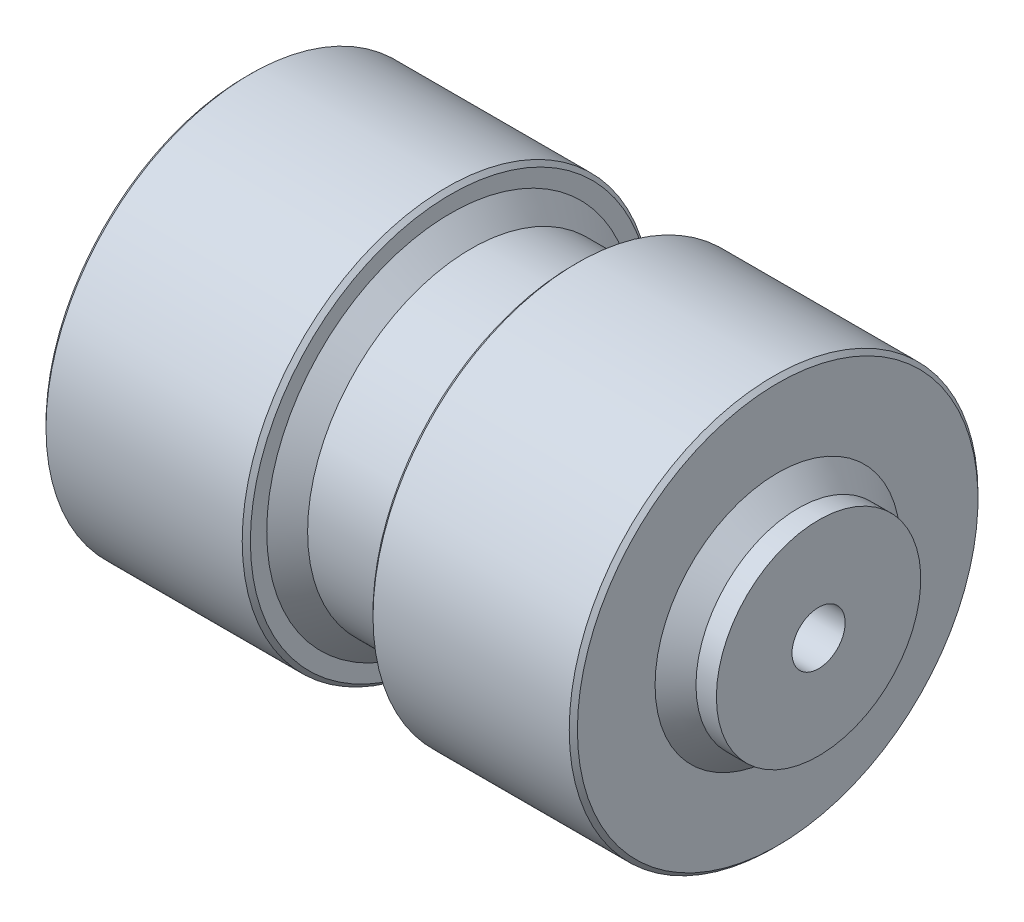
ISO-10303-21;
HEADER;
FILE_DESCRIPTION(('STEP AP214'),'2;1');
FILE_NAME('part.step','',(''),(''),'','','');
FILE_SCHEMA(('AUTOMOTIVE_DESIGN { 1 0 10303 214 1 1 1 1 }'));
ENDSEC;
DATA;
#1=APPLICATION_CONTEXT('core data for automotive mechanical design processes');
#2=APPLICATION_PROTOCOL_DEFINITION('international standard','automotive_design',2000,#1);
#3=PRODUCT_CONTEXT('',#1,'mechanical');
#4=PRODUCT('Part','Part','',(#3));
#5=PRODUCT_RELATED_PRODUCT_CATEGORY('part','',(#4));
#6=PRODUCT_DEFINITION_FORMATION('','',#4);
#7=PRODUCT_DEFINITION_CONTEXT('part definition',#1,'design');
#8=PRODUCT_DEFINITION('design','',#6,#7);
#9=PRODUCT_DEFINITION_SHAPE('','',#8);
#10=(LENGTH_UNIT() NAMED_UNIT(*) SI_UNIT(.MILLI.,.METRE.));
#11=(NAMED_UNIT(*) PLANE_ANGLE_UNIT() SI_UNIT($,.RADIAN.));
#12=(NAMED_UNIT(*) SI_UNIT($,.STERADIAN.) SOLID_ANGLE_UNIT());
#13=UNCERTAINTY_MEASURE_WITH_UNIT(LENGTH_MEASURE(1.E-05),#10,'distance_accuracy_value','');
#14=(GEOMETRIC_REPRESENTATION_CONTEXT(3) GLOBAL_UNCERTAINTY_ASSIGNED_CONTEXT((#13)) GLOBAL_UNIT_ASSIGNED_CONTEXT((#10,
#11,#12)) REPRESENTATION_CONTEXT('',''));
#15=CARTESIAN_POINT('',(0.,0.,0.));
#16=DIRECTION('',(0.,0.,1.));
#17=DIRECTION('',(1.,0.,0.));
#18=AXIS2_PLACEMENT_3D('',#15,#16,#17);
#19=CARTESIAN_POINT('',(-7.5,0.,0.));
#20=DIRECTION('',(-1.,0.,0.));
#21=DIRECTION('',(0.,0.,1.));
#22=AXIS2_PLACEMENT_3D('',#19,#20,#21);
#23=CYLINDRICAL_SURFACE('',#22,5.);
#24=CARTESIAN_POINT('',(-1.6,0.,0.));
#25=DIRECTION('',(-1.,0.,0.));
#26=DIRECTION('',(0.,0.,1.));
#27=AXIS2_PLACEMENT_3D('',#24,#25,#26);
#28=CIRCLE('',#27,5.);
#29=CARTESIAN_POINT('',(-1.6,0.,5.));
#30=VERTEX_POINT('',#29);
#31=EDGE_CURVE('E42',#30,#30,#28,.T.);
#32=ORIENTED_EDGE('',*,*,#31,.T.);
#33=EDGE_LOOP('',(#32));
#34=FACE_BOUND('',#33,.T.);
#35=CARTESIAN_POINT('',(-6.4,0.,0.));
#36=DIRECTION('',(1.,0.,0.));
#37=DIRECTION('',(0.,0.,-1.));
#38=AXIS2_PLACEMENT_3D('',#35,#36,#37);
#39=CIRCLE('',#38,5.);
#40=CARTESIAN_POINT('',(-6.4,0.,-5.));
#41=VERTEX_POINT('',#40);
#42=EDGE_CURVE('E46',#41,#41,#39,.T.);
#43=ORIENTED_EDGE('',*,*,#42,.T.);
#44=EDGE_LOOP('',(#43));
#45=FACE_BOUND('',#44,.T.);
#46=ADVANCED_FACE('F31',(#34,#45),#23,.T.);
#47=CARTESIAN_POINT('',(-1.5,5.,0.));
#48=DIRECTION('',(-1.,0.,0.));
#49=DIRECTION('',(0.,0.,1.));
#50=AXIS2_PLACEMENT_3D('',#47,#48,#49);
#51=PLANE('',#50);
#52=CARTESIAN_POINT('',(-1.5,0.,0.));
#53=DIRECTION('',(-1.,0.,0.));
#54=DIRECTION('',(0.,0.,1.));
#55=AXIS2_PLACEMENT_3D('',#52,#53,#54);
#56=CIRCLE('',#55,4.9);
#57=CARTESIAN_POINT('',(-1.5,0.,4.9));
#58=VERTEX_POINT('',#57);
#59=EDGE_CURVE('E38',#58,#58,#56,.F.);
#60=ORIENTED_EDGE('',*,*,#59,.T.);
#61=EDGE_LOOP('',(#60));
#62=FACE_BOUND('',#61,.T.);
#63=CARTESIAN_POINT('',(-1.5,0.,0.));
#64=DIRECTION('',(-1.,0.,0.));
#65=DIRECTION('',(0.,0.,1.));
#66=AXIS2_PLACEMENT_3D('',#63,#64,#65);
#67=CIRCLE('',#66,4.5);
#68=CARTESIAN_POINT('',(-1.5,0.,4.5));
#69=VERTEX_POINT('',#68);
#70=EDGE_CURVE('E75',#69,#69,#67,.T.);
#71=ORIENTED_EDGE('',*,*,#70,.T.);
#72=EDGE_LOOP('',(#71));
#73=FACE_BOUND('',#72,.T.);
#74=ADVANCED_FACE('F117',(#62,#73),#51,.F.);
#75=CARTESIAN_POINT('',(-7.5,0.,0.));
#76=DIRECTION('',(-1.,0.,0.));
#77=DIRECTION('',(0.,0.,1.));
#78=AXIS2_PLACEMENT_3D('',#75,#76,#77);
#79=CYLINDRICAL_SURFACE('',#78,4.);
#80=CARTESIAN_POINT('',(0.999999999999992,0.,0.));
#81=DIRECTION('',(1.,0.,0.));
#82=DIRECTION('',(0.,0.,-1.));
#83=AXIS2_PLACEMENT_3D('',#80,#81,#82);
#84=CIRCLE('',#83,4.);
#85=CARTESIAN_POINT('',(0.999999999999992,0.,-4.));
#86=VERTEX_POINT('',#85);
#87=EDGE_CURVE('E81',#86,#86,#84,.F.);
#88=ORIENTED_EDGE('',*,*,#87,.T.);
#89=EDGE_LOOP('',(#88));
#90=FACE_BOUND('',#89,.T.);
#91=CARTESIAN_POINT('',(-1.,0.,0.));
#92=DIRECTION('',(-1.,0.,0.));
#93=DIRECTION('',(0.,0.,1.));
#94=AXIS2_PLACEMENT_3D('',#91,#92,#93);
#95=CIRCLE('',#94,4.);
#96=CARTESIAN_POINT('',(-1.,0.,4.));
#97=VERTEX_POINT('',#96);
#98=EDGE_CURVE('E84',#97,#97,#95,.F.);
#99=ORIENTED_EDGE('',*,*,#98,.T.);
#100=EDGE_LOOP('',(#99));
#101=FACE_BOUND('',#100,.T.);
#102=ADVANCED_FACE('F123',(#90,#101),#79,.T.);
#103=CARTESIAN_POINT('',(1.5,4.,0.));
#104=DIRECTION('',(1.,0.,0.));
#105=DIRECTION('',(0.,0.,-1.));
#106=AXIS2_PLACEMENT_3D('',#103,#104,#105);
#107=PLANE('',#106);
#108=CARTESIAN_POINT('',(1.5,0.,0.));
#109=DIRECTION('',(1.,0.,0.));
#110=DIRECTION('',(0.,0.,-1.));
#111=AXIS2_PLACEMENT_3D('',#108,#109,#110);
#112=CIRCLE('',#111,4.9);
#113=CARTESIAN_POINT('',(1.5,0.,-4.9));
#114=VERTEX_POINT('',#113);
#115=EDGE_CURVE('E51',#114,#114,#112,.F.);
#116=ORIENTED_EDGE('',*,*,#115,.T.);
#117=EDGE_LOOP('',(#116));
#118=FACE_BOUND('',#117,.T.);
#119=CARTESIAN_POINT('',(1.5,0.,0.));
#120=DIRECTION('',(1.,0.,0.));
#121=DIRECTION('',(0.,0.,-1.));
#122=AXIS2_PLACEMENT_3D('',#119,#120,#121);
#123=CIRCLE('',#122,4.5);
#124=CARTESIAN_POINT('',(1.5,0.,-4.5));
#125=VERTEX_POINT('',#124);
#126=EDGE_CURVE('E78',#125,#125,#123,.T.);
#127=ORIENTED_EDGE('',*,*,#126,.T.);
#128=EDGE_LOOP('',(#127));
#129=FACE_BOUND('',#128,.T.);
#130=ADVANCED_FACE('F211',(#118,#129),#107,.F.);
#131=CARTESIAN_POINT('',(-7.5,0.,0.));
#132=DIRECTION('',(-1.,0.,0.));
#133=DIRECTION('',(0.,0.,1.));
#134=AXIS2_PLACEMENT_3D('',#131,#132,#133);
#135=CYLINDRICAL_SURFACE('',#134,5.);
#136=CARTESIAN_POINT('',(6.4,0.,0.));
#137=DIRECTION('',(-1.,0.,0.));
#138=DIRECTION('',(0.,0.,1.));
#139=AXIS2_PLACEMENT_3D('',#136,#137,#138);
#140=CIRCLE('',#139,5.);
#141=CARTESIAN_POINT('',(6.4,0.,5.));
#142=VERTEX_POINT('',#141);
#143=EDGE_CURVE('E57',#142,#142,#140,.T.);
#144=ORIENTED_EDGE('',*,*,#143,.T.);
#145=EDGE_LOOP('',(#144));
#146=FACE_BOUND('',#145,.T.);
#147=CARTESIAN_POINT('',(1.6,0.,0.));
#148=DIRECTION('',(1.,0.,0.));
#149=DIRECTION('',(0.,0.,-1.));
#150=AXIS2_PLACEMENT_3D('',#147,#148,#149);
#151=CIRCLE('',#150,5.);
#152=CARTESIAN_POINT('',(1.6,0.,-5.));
#153=VERTEX_POINT('',#152);
#154=EDGE_CURVE('E60',#153,#153,#151,.T.);
#155=ORIENTED_EDGE('',*,*,#154,.T.);
#156=EDGE_LOOP('',(#155));
#157=FACE_BOUND('',#156,.T.);
#158=ADVANCED_FACE('F199',(#146,#157),#135,.T.);
#159=CARTESIAN_POINT('',(6.5,5.,0.));
#160=DIRECTION('',(-1.,0.,0.));
#161=DIRECTION('',(0.,0.,1.));
#162=AXIS2_PLACEMENT_3D('',#159,#160,#161);
#163=PLANE('',#162);
#164=CARTESIAN_POINT('',(6.5,0.,0.));
#165=DIRECTION('',(-1.,0.,0.));
#166=DIRECTION('',(0.,0.,1.));
#167=AXIS2_PLACEMENT_3D('',#164,#165,#166);
#168=CIRCLE('',#167,4.9);
#169=CARTESIAN_POINT('',(6.5,0.,4.9));
#170=VERTEX_POINT('',#169);
#171=EDGE_CURVE('E54',#170,#170,#168,.F.);
#172=ORIENTED_EDGE('',*,*,#171,.T.);
#173=EDGE_LOOP('',(#172));
#174=FACE_BOUND('',#173,.T.);
#175=CARTESIAN_POINT('',(6.5,0.,0.));
#176=DIRECTION('',(-1.,0.,0.));
#177=DIRECTION('',(0.,0.,1.));
#178=AXIS2_PLACEMENT_3D('',#175,#176,#177);
#179=CIRCLE('',#178,3.);
#180=CARTESIAN_POINT('',(6.5,0.,3.));
#181=VERTEX_POINT('',#180);
#182=EDGE_CURVE('E72',#181,#181,#179,.T.);
#183=ORIENTED_EDGE('',*,*,#182,.T.);
#184=EDGE_LOOP('',(#183));
#185=FACE_BOUND('',#184,.T.);
#186=ADVANCED_FACE('F193',(#174,#185),#163,.F.);
#187=CARTESIAN_POINT('',(-7.5,0.,0.));
#188=DIRECTION('',(-1.,0.,0.));
#189=DIRECTION('',(0.,0.,1.));
#190=AXIS2_PLACEMENT_3D('',#187,#188,#189);
#191=CYLINDRICAL_SURFACE('',#190,2.5);
#192=CARTESIAN_POINT('',(7.,0.,0.));
#193=DIRECTION('',(-1.,0.,0.));
#194=DIRECTION('',(0.,0.,1.));
#195=AXIS2_PLACEMENT_3D('',#192,#193,#194);
#196=CIRCLE('',#195,2.5);
#197=CARTESIAN_POINT('',(7.,0.,2.5));
#198=VERTEX_POINT('',#197);
#199=EDGE_CURVE('E69',#198,#198,#196,.F.);
#200=ORIENTED_EDGE('',*,*,#199,.T.);
#201=EDGE_LOOP('',(#200));
#202=FACE_BOUND('',#201,.T.);
#203=CARTESIAN_POINT('',(7.5,0.,0.));
#204=DIRECTION('',(-1.,0.,0.));
#205=DIRECTION('',(0.,0.,1.));
#206=AXIS2_PLACEMENT_3D('',#203,#204,#205);
#207=CIRCLE('',#206,2.5);
#208=CARTESIAN_POINT('',(7.5,0.,2.5));
#209=VERTEX_POINT('',#208);
#210=EDGE_CURVE('E87',#209,#209,#207,.T.);
#211=ORIENTED_EDGE('',*,*,#210,.T.);
#212=EDGE_LOOP('',(#211));
#213=FACE_BOUND('',#212,.T.);
#214=ADVANCED_FACE('F198',(#202,#213),#191,.T.);
#215=CARTESIAN_POINT('',(7.5,0.65,0.));
#216=DIRECTION('',(-1.,0.,0.));
#217=DIRECTION('',(0.,0.,1.));
#218=AXIS2_PLACEMENT_3D('',#215,#216,#217);
#219=PLANE('',#218);
#220=ORIENTED_EDGE('',*,*,#210,.F.);
#221=EDGE_LOOP('',(#220));
#222=FACE_BOUND('',#221,.T.);
#223=CARTESIAN_POINT('',(7.5,0.,0.));
#224=DIRECTION('',(-1.,0.,0.));
#225=DIRECTION('',(0.,0.,1.));
#226=AXIS2_PLACEMENT_3D('',#223,#224,#225);
#227=CIRCLE('',#226,0.65);
#228=CARTESIAN_POINT('',(7.5,0.,0.65));
#229=VERTEX_POINT('',#228);
#230=EDGE_CURVE('E90',#229,#229,#227,.T.);
#231=ORIENTED_EDGE('',*,*,#230,.T.);
#232=EDGE_LOOP('',(#231));
#233=FACE_BOUND('',#232,.T.);
#234=ADVANCED_FACE('F266',(#222,#233),#219,.F.);
#235=CARTESIAN_POINT('',(-7.5,0.,0.));
#236=DIRECTION('',(-1.,0.,0.));
#237=DIRECTION('',(0.,0.,1.));
#238=AXIS2_PLACEMENT_3D('',#235,#236,#237);
#239=CYLINDRICAL_SURFACE('',#238,0.65);
#240=ORIENTED_EDGE('',*,*,#230,.F.);
#241=EDGE_LOOP('',(#240));
#242=FACE_BOUND('',#241,.T.);
#243=CARTESIAN_POINT('',(-7.5,0.,0.));
#244=DIRECTION('',(-1.,0.,0.));
#245=DIRECTION('',(0.,0.,1.));
#246=AXIS2_PLACEMENT_3D('',#243,#244,#245);
#247=CIRCLE('',#246,0.65);
#248=CARTESIAN_POINT('',(-7.5,0.,0.65));
#249=VERTEX_POINT('',#248);
#250=EDGE_CURVE('E93',#249,#249,#247,.T.);
#251=ORIENTED_EDGE('',*,*,#250,.T.);
#252=EDGE_LOOP('',(#251));
#253=FACE_BOUND('',#252,.T.);
#254=ADVANCED_FACE('F113',(#242,#253),#239,.F.);
#255=CARTESIAN_POINT('',(-7.5,2.5,0.));
#256=DIRECTION('',(1.,0.,0.));
#257=DIRECTION('',(0.,0.,-1.));
#258=AXIS2_PLACEMENT_3D('',#255,#256,#257);
#259=PLANE('',#258);
#260=ORIENTED_EDGE('',*,*,#250,.F.);
#261=EDGE_LOOP('',(#260));
#262=FACE_BOUND('',#261,.T.);
#263=CARTESIAN_POINT('',(-7.5,0.,0.));
#264=DIRECTION('',(-1.,0.,0.));
#265=DIRECTION('',(0.,0.,1.));
#266=AXIS2_PLACEMENT_3D('',#263,#264,#265);
#267=CIRCLE('',#266,2.5);
#268=CARTESIAN_POINT('',(-7.5,0.,2.5));
#269=VERTEX_POINT('',#268);
#270=EDGE_CURVE('E96',#269,#269,#267,.T.);
#271=ORIENTED_EDGE('',*,*,#270,.T.);
#272=EDGE_LOOP('',(#271));
#273=FACE_BOUND('',#272,.T.);
#274=ADVANCED_FACE('F100',(#262,#273),#259,.F.);
#275=CARTESIAN_POINT('',(-7.5,0.,0.));
#276=DIRECTION('',(-1.,0.,0.));
#277=DIRECTION('',(0.,0.,1.));
#278=AXIS2_PLACEMENT_3D('',#275,#276,#277);
#279=CYLINDRICAL_SURFACE('',#278,2.5);
#280=CARTESIAN_POINT('',(-7.00000000000001,0.,0.));
#281=DIRECTION('',(1.,0.,0.));
#282=DIRECTION('',(0.,0.,-1.));
#283=AXIS2_PLACEMENT_3D('',#280,#281,#282);
#284=CIRCLE('',#283,2.5);
#285=CARTESIAN_POINT('',(-7.00000000000001,0.,-2.5));
#286=VERTEX_POINT('',#285);
#287=EDGE_CURVE('E66',#286,#286,#284,.F.);
#288=ORIENTED_EDGE('',*,*,#287,.T.);
#289=EDGE_LOOP('',(#288));
#290=FACE_BOUND('',#289,.T.);
#291=ORIENTED_EDGE('',*,*,#270,.F.);
#292=EDGE_LOOP('',(#291));
#293=FACE_BOUND('',#292,.T.);
#294=ADVANCED_FACE('F102',(#290,#293),#279,.T.);
#295=CARTESIAN_POINT('',(-6.5,2.5,0.));
#296=DIRECTION('',(1.,0.,0.));
#297=DIRECTION('',(0.,0.,-1.));
#298=AXIS2_PLACEMENT_3D('',#295,#296,#297);
#299=PLANE('',#298);
#300=CARTESIAN_POINT('',(-6.5,0.,0.));
#301=DIRECTION('',(1.,0.,0.));
#302=DIRECTION('',(0.,0.,-1.));
#303=AXIS2_PLACEMENT_3D('',#300,#301,#302);
#304=CIRCLE('',#303,4.9);
#305=CARTESIAN_POINT('',(-6.5,0.,-4.9));
#306=VERTEX_POINT('',#305);
#307=EDGE_CURVE('E10',#306,#306,#304,.F.);
#308=ORIENTED_EDGE('',*,*,#307,.T.);
#309=EDGE_LOOP('',(#308));
#310=FACE_BOUND('',#309,.T.);
#311=CARTESIAN_POINT('',(-6.5,0.,0.));
#312=DIRECTION('',(1.,0.,0.));
#313=DIRECTION('',(0.,0.,-1.));
#314=AXIS2_PLACEMENT_3D('',#311,#312,#313);
#315=CIRCLE('',#314,3.);
#316=CARTESIAN_POINT('',(-6.5,0.,-3.));
#317=VERTEX_POINT('',#316);
#318=EDGE_CURVE('E63',#317,#317,#315,.T.);
#319=ORIENTED_EDGE('',*,*,#318,.T.);
#320=EDGE_LOOP('',(#319));
#321=FACE_BOUND('',#320,.T.);
#322=ADVANCED_FACE('F104',(#310,#321),#299,.F.);
#323=CARTESIAN_POINT('',(0.999999999999992,0.,0.));
#324=DIRECTION('',(1.,0.,0.));
#325=DIRECTION('',(0.,0.,-1.));
#326=AXIS2_PLACEMENT_3D('',#323,#324,#325);
#327=CONICAL_SURFACE('',#326,4.,0.785398163397443);
#328=ORIENTED_EDGE('',*,*,#126,.F.);
#329=EDGE_LOOP('',(#328));
#330=FACE_BOUND('',#329,.T.);
#331=ORIENTED_EDGE('',*,*,#87,.F.);
#332=EDGE_LOOP('',(#331));
#333=FACE_BOUND('',#332,.T.);
#334=ADVANCED_FACE('F111',(#330,#333),#327,.T.);
#335=CARTESIAN_POINT('',(-1.5,0.,0.));
#336=DIRECTION('',(-1.,0.,0.));
#337=DIRECTION('',(0.,0.,1.));
#338=AXIS2_PLACEMENT_3D('',#335,#336,#337);
#339=CONICAL_SURFACE('',#338,4.5,0.785398163397454);
#340=ORIENTED_EDGE('',*,*,#98,.F.);
#341=EDGE_LOOP('',(#340));
#342=FACE_BOUND('',#341,.T.);
#343=ORIENTED_EDGE('',*,*,#70,.F.);
#344=EDGE_LOOP('',(#343));
#345=FACE_BOUND('',#344,.T.);
#346=ADVANCED_FACE('F130',(#342,#345),#339,.T.);
#347=CARTESIAN_POINT('',(6.5,0.,0.));
#348=DIRECTION('',(-1.,0.,0.));
#349=DIRECTION('',(0.,0.,1.));
#350=AXIS2_PLACEMENT_3D('',#347,#348,#349);
#351=CONICAL_SURFACE('',#350,3.,0.785398163397452);
#352=ORIENTED_EDGE('',*,*,#199,.F.);
#353=EDGE_LOOP('',(#352));
#354=FACE_BOUND('',#353,.T.);
#355=ORIENTED_EDGE('',*,*,#182,.F.);
#356=EDGE_LOOP('',(#355));
#357=FACE_BOUND('',#356,.T.);
#358=ADVANCED_FACE('F134',(#354,#357),#351,.T.);
#359=CARTESIAN_POINT('',(-7.00000000000001,0.,0.));
#360=DIRECTION('',(1.,0.,0.));
#361=DIRECTION('',(0.,0.,-1.));
#362=AXIS2_PLACEMENT_3D('',#359,#360,#361);
#363=CONICAL_SURFACE('',#362,2.5,0.785398163397444);
#364=ORIENTED_EDGE('',*,*,#318,.F.);
#365=EDGE_LOOP('',(#364));
#366=FACE_BOUND('',#365,.T.);
#367=ORIENTED_EDGE('',*,*,#287,.F.);
#368=EDGE_LOOP('',(#367));
#369=FACE_BOUND('',#368,.T.);
#370=ADVANCED_FACE('F138',(#366,#369),#363,.T.);
#371=CARTESIAN_POINT('',(6.4,0.,0.));
#372=DIRECTION('',(-1.,0.,0.));
#373=DIRECTION('',(0.,0.,1.));
#374=AXIS2_PLACEMENT_3D('',#371,#372,#373);
#375=CONICAL_SURFACE('',#374,5.,0.785398163397453);
#376=ORIENTED_EDGE('',*,*,#171,.F.);
#377=EDGE_LOOP('',(#376));
#378=FACE_BOUND('',#377,.T.);
#379=ORIENTED_EDGE('',*,*,#143,.F.);
#380=EDGE_LOOP('',(#379));
#381=FACE_BOUND('',#380,.T.);
#382=ADVANCED_FACE('F142',(#378,#381),#375,.T.);
#383=CARTESIAN_POINT('',(1.5,0.,0.));
#384=DIRECTION('',(1.,0.,0.));
#385=DIRECTION('',(0.,0.,-1.));
#386=AXIS2_PLACEMENT_3D('',#383,#384,#385);
#387=CONICAL_SURFACE('',#386,4.9,0.785398163397435);
#388=ORIENTED_EDGE('',*,*,#154,.F.);
#389=EDGE_LOOP('',(#388));
#390=FACE_BOUND('',#389,.T.);
#391=ORIENTED_EDGE('',*,*,#115,.F.);
#392=EDGE_LOOP('',(#391));
#393=FACE_BOUND('',#392,.T.);
#394=ADVANCED_FACE('F146',(#390,#393),#387,.T.);
#395=CARTESIAN_POINT('',(-1.6,0.,0.));
#396=DIRECTION('',(-1.,0.,0.));
#397=DIRECTION('',(0.,0.,1.));
#398=AXIS2_PLACEMENT_3D('',#395,#396,#397);
#399=CONICAL_SURFACE('',#398,5.,0.785398163397461);
#400=ORIENTED_EDGE('',*,*,#59,.F.);
#401=EDGE_LOOP('',(#400));
#402=FACE_BOUND('',#401,.T.);
#403=ORIENTED_EDGE('',*,*,#31,.F.);
#404=EDGE_LOOP('',(#403));
#405=FACE_BOUND('',#404,.T.);
#406=ADVANCED_FACE('F149',(#402,#405),#399,.T.);
#407=CARTESIAN_POINT('',(-6.5,0.,0.));
#408=DIRECTION('',(1.,0.,0.));
#409=DIRECTION('',(0.,0.,-1.));
#410=AXIS2_PLACEMENT_3D('',#407,#408,#409);
#411=CONICAL_SURFACE('',#410,4.9,0.785398163397453);
#412=ORIENTED_EDGE('',*,*,#42,.F.);
#413=EDGE_LOOP('',(#412));
#414=FACE_BOUND('',#413,.T.);
#415=ORIENTED_EDGE('',*,*,#307,.F.);
#416=EDGE_LOOP('',(#415));
#417=FACE_BOUND('',#416,.T.);
#418=ADVANCED_FACE('F33',(#414,#417),#411,.T.);
#419=CLOSED_SHELL('',(#46,#74,#102,#130,#158,#186,#214,#234,#254,#274,#294,#322,#334,#346,#358,
#370,#382,#394,#406,#418));
#420=MANIFOLD_SOLID_BREP('B2',#419);
#421=ADVANCED_BREP_SHAPE_REPRESENTATION('',(#18,#420),#14);
#422=SHAPE_DEFINITION_REPRESENTATION(#9,#421);
ENDSEC;
END-ISO-10303-21;
